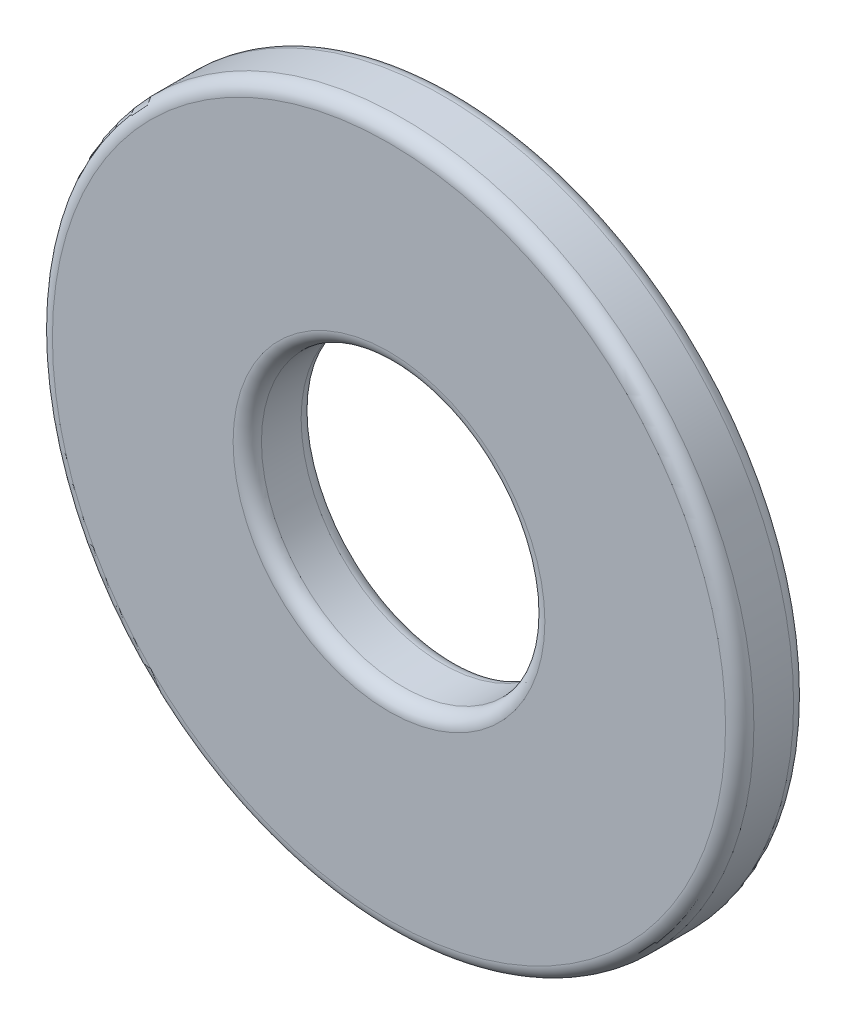
ISO-10303-21;
HEADER;
FILE_DESCRIPTION(('STEP AP214'),'2;1');
FILE_NAME('part.step','',(''),(''),'','','');
FILE_SCHEMA(('AUTOMOTIVE_DESIGN { 1 0 10303 214 1 1 1 1 }'));
ENDSEC;
DATA;
#1=APPLICATION_CONTEXT('core data for automotive mechanical design processes');
#2=APPLICATION_PROTOCOL_DEFINITION('international standard','automotive_design',2000,#1);
#3=PRODUCT_CONTEXT('',#1,'mechanical');
#4=PRODUCT('Part','Part','',(#3));
#5=PRODUCT_RELATED_PRODUCT_CATEGORY('part','',(#4));
#6=PRODUCT_DEFINITION_FORMATION('','',#4);
#7=PRODUCT_DEFINITION_CONTEXT('part definition',#1,'design');
#8=PRODUCT_DEFINITION('design','',#6,#7);
#9=PRODUCT_DEFINITION_SHAPE('','',#8);
#10=(LENGTH_UNIT() NAMED_UNIT(*) SI_UNIT(.MILLI.,.METRE.));
#11=(NAMED_UNIT(*) PLANE_ANGLE_UNIT() SI_UNIT($,.RADIAN.));
#12=(NAMED_UNIT(*) SI_UNIT($,.STERADIAN.) SOLID_ANGLE_UNIT());
#13=UNCERTAINTY_MEASURE_WITH_UNIT(LENGTH_MEASURE(1.E-05),#10,'distance_accuracy_value','');
#14=(GEOMETRIC_REPRESENTATION_CONTEXT(3) GLOBAL_UNCERTAINTY_ASSIGNED_CONTEXT((#13)) GLOBAL_UNIT_ASSIGNED_CONTEXT((#10,
#11,#12)) REPRESENTATION_CONTEXT('',''));
#15=CARTESIAN_POINT('',(0.,0.,0.));
#16=DIRECTION('',(0.,0.,1.));
#17=DIRECTION('',(1.,0.,0.));
#18=AXIS2_PLACEMENT_3D('',#15,#16,#17);
#19=CARTESIAN_POINT('',(0.,0.,0.96));
#20=DIRECTION('',(0.,0.,1.));
#21=DIRECTION('',(1.,0.,0.));
#22=AXIS2_PLACEMENT_3D('',#19,#20,#21);
#23=PLANE('',#22);
#24=CARTESIAN_POINT('',(0.,0.,0.96));
#25=DIRECTION('',(0.,0.,1.));
#26=DIRECTION('',(1.,0.,0.));
#27=AXIS2_PLACEMENT_3D('',#24,#25,#26);
#28=CIRCLE('',#27,2.2);
#29=CARTESIAN_POINT('',(2.2,0.,0.96));
#30=VERTEX_POINT('',#29);
#31=EDGE_CURVE('E10',#30,#30,#28,.F.);
#32=ORIENTED_EDGE('',*,*,#31,.T.);
#33=EDGE_LOOP('',(#32));
#34=FACE_BOUND('',#33,.T.);
#35=CARTESIAN_POINT('',(0.,0.,0.96));
#36=DIRECTION('',(0.,0.,1.));
#37=DIRECTION('',(1.,0.,0.));
#38=AXIS2_PLACEMENT_3D('',#35,#36,#37);
#39=CIRCLE('',#38,4.75);
#40=CARTESIAN_POINT('',(4.75,0.,0.96));
#41=VERTEX_POINT('',#40);
#42=EDGE_CURVE('E48',#41,#41,#39,.T.);
#43=ORIENTED_EDGE('',*,*,#42,.T.);
#44=EDGE_LOOP('',(#43));
#45=FACE_BOUND('',#44,.T.);
#46=ADVANCED_FACE('F41',(#34,#45),#23,.T.);
#47=CARTESIAN_POINT('',(0.,0.,0.));
#48=DIRECTION('',(0.,0.,1.));
#49=DIRECTION('',(1.,0.,0.));
#50=AXIS2_PLACEMENT_3D('',#47,#48,#49);
#51=PLANE('',#50);
#52=CARTESIAN_POINT('',(0.,0.,0.));
#53=DIRECTION('',(0.,0.,1.));
#54=DIRECTION('',(1.,0.,0.));
#55=AXIS2_PLACEMENT_3D('',#52,#53,#54);
#56=CIRCLE('',#55,2.2);
#57=CARTESIAN_POINT('',(2.2,0.,0.));
#58=VERTEX_POINT('',#57);
#59=EDGE_CURVE('E67',#58,#58,#56,.T.);
#60=ORIENTED_EDGE('',*,*,#59,.T.);
#61=EDGE_LOOP('',(#60));
#62=FACE_BOUND('',#61,.T.);
#63=CARTESIAN_POINT('',(0.,0.,0.));
#64=DIRECTION('',(0.,0.,1.));
#65=DIRECTION('',(1.,0.,0.));
#66=AXIS2_PLACEMENT_3D('',#63,#64,#65);
#67=CIRCLE('',#66,4.75);
#68=CARTESIAN_POINT('',(4.75,0.,0.));
#69=VERTEX_POINT('',#68);
#70=EDGE_CURVE('E70',#69,#69,#67,.F.);
#71=ORIENTED_EDGE('',*,*,#70,.T.);
#72=EDGE_LOOP('',(#71));
#73=FACE_BOUND('',#72,.T.);
#74=ADVANCED_FACE('F74',(#62,#73),#51,.F.);
#75=CARTESIAN_POINT('',(0.,0.,0.96));
#76=DIRECTION('',(0.,0.,-1.));
#77=DIRECTION('',(-1.,0.,0.));
#78=AXIS2_PLACEMENT_3D('',#75,#76,#77);
#79=CYLINDRICAL_SURFACE('',#78,4.95);
#80=CARTESIAN_POINT('',(0.,0.,0.2));
#81=DIRECTION('',(0.,0.,1.));
#82=DIRECTION('',(1.,0.,0.));
#83=AXIS2_PLACEMENT_3D('',#80,#81,#82);
#84=CIRCLE('',#83,4.95);
#85=CARTESIAN_POINT('',(4.95,0.,0.2));
#86=VERTEX_POINT('',#85);
#87=EDGE_CURVE('E52',#86,#86,#84,.T.);
#88=ORIENTED_EDGE('',*,*,#87,.T.);
#89=EDGE_LOOP('',(#88));
#90=FACE_BOUND('',#89,.T.);
#91=CARTESIAN_POINT('',(0.,0.,0.76));
#92=DIRECTION('',(0.,0.,1.));
#93=DIRECTION('',(1.,0.,0.));
#94=AXIS2_PLACEMENT_3D('',#91,#92,#93);
#95=CIRCLE('',#94,4.95);
#96=CARTESIAN_POINT('',(4.95,0.,0.76));
#97=VERTEX_POINT('',#96);
#98=EDGE_CURVE('E56',#97,#97,#95,.F.);
#99=ORIENTED_EDGE('',*,*,#98,.T.);
#100=EDGE_LOOP('',(#99));
#101=FACE_BOUND('',#100,.T.);
#102=ADVANCED_FACE('F84',(#90,#101),#79,.T.);
#103=CARTESIAN_POINT('',(0.,0.,0.96));
#104=DIRECTION('',(0.,0.,-1.));
#105=DIRECTION('',(-1.,0.,0.));
#106=AXIS2_PLACEMENT_3D('',#103,#104,#105);
#107=CYLINDRICAL_SURFACE('',#106,2.);
#108=CARTESIAN_POINT('',(0.,0.,0.2));
#109=DIRECTION('',(0.,0.,1.));
#110=DIRECTION('',(1.,0.,0.));
#111=AXIS2_PLACEMENT_3D('',#108,#109,#110);
#112=CIRCLE('',#111,2.);
#113=CARTESIAN_POINT('',(2.,0.,0.2));
#114=VERTEX_POINT('',#113);
#115=EDGE_CURVE('E61',#114,#114,#112,.F.);
#116=ORIENTED_EDGE('',*,*,#115,.T.);
#117=EDGE_LOOP('',(#116));
#118=FACE_BOUND('',#117,.T.);
#119=CARTESIAN_POINT('',(0.,0.,0.76));
#120=DIRECTION('',(0.,0.,1.));
#121=DIRECTION('',(1.,0.,0.));
#122=AXIS2_PLACEMENT_3D('',#119,#120,#121);
#123=CIRCLE('',#122,2.);
#124=CARTESIAN_POINT('',(2.,0.,0.76));
#125=VERTEX_POINT('',#124);
#126=EDGE_CURVE('E64',#125,#125,#123,.T.);
#127=ORIENTED_EDGE('',*,*,#126,.T.);
#128=EDGE_LOOP('',(#127));
#129=FACE_BOUND('',#128,.T.);
#130=ADVANCED_FACE('F87',(#118,#129),#107,.F.);
#131=CARTESIAN_POINT('',(0.,0.,0.2));
#132=DIRECTION('',(0.,0.,1.));
#133=DIRECTION('',(1.,0.,0.));
#134=AXIS2_PLACEMENT_3D('',#131,#132,#133);
#135=TOROIDAL_SURFACE('',#134,2.2,0.2);
#136=ORIENTED_EDGE('',*,*,#115,.F.);
#137=EDGE_LOOP('',(#136));
#138=FACE_BOUND('',#137,.T.);
#139=ORIENTED_EDGE('',*,*,#59,.F.);
#140=EDGE_LOOP('',(#139));
#141=FACE_BOUND('',#140,.T.);
#142=ADVANCED_FACE('F80',(#138,#141),#135,.T.);
#143=CARTESIAN_POINT('',(0.,0.,0.2));
#144=DIRECTION('',(0.,0.,1.));
#145=DIRECTION('',(1.,0.,0.));
#146=AXIS2_PLACEMENT_3D('',#143,#144,#145);
#147=TOROIDAL_SURFACE('',#146,4.75,0.2);
#148=ORIENTED_EDGE('',*,*,#70,.F.);
#149=EDGE_LOOP('',(#148));
#150=FACE_BOUND('',#149,.T.);
#151=ORIENTED_EDGE('',*,*,#87,.F.);
#152=EDGE_LOOP('',(#151));
#153=FACE_BOUND('',#152,.T.);
#154=ADVANCED_FACE('F76',(#150,#153),#147,.T.);
#155=CARTESIAN_POINT('',(0.,0.,0.76));
#156=DIRECTION('',(0.,0.,1.));
#157=DIRECTION('',(1.,0.,0.));
#158=AXIS2_PLACEMENT_3D('',#155,#156,#157);
#159=TOROIDAL_SURFACE('',#158,2.2,0.2);
#160=ORIENTED_EDGE('',*,*,#31,.F.);
#161=EDGE_LOOP('',(#160));
#162=FACE_BOUND('',#161,.T.);
#163=ORIENTED_EDGE('',*,*,#126,.F.);
#164=EDGE_LOOP('',(#163));
#165=FACE_BOUND('',#164,.T.);
#166=ADVANCED_FACE('F79',(#162,#165),#159,.T.);
#167=CARTESIAN_POINT('',(0.,0.,0.76));
#168=DIRECTION('',(0.,0.,1.));
#169=DIRECTION('',(1.,0.,0.));
#170=AXIS2_PLACEMENT_3D('',#167,#168,#169);
#171=TOROIDAL_SURFACE('',#170,4.75,0.2);
#172=ORIENTED_EDGE('',*,*,#98,.F.);
#173=EDGE_LOOP('',(#172));
#174=FACE_BOUND('',#173,.T.);
#175=ORIENTED_EDGE('',*,*,#42,.F.);
#176=EDGE_LOOP('',(#175));
#177=FACE_BOUND('',#176,.T.);
#178=ADVANCED_FACE('F43',(#174,#177),#171,.T.);
#179=CLOSED_SHELL('',(#46,#74,#102,#130,#142,#154,#166,#178));
#180=MANIFOLD_SOLID_BREP('B2',#179);
#181=ADVANCED_BREP_SHAPE_REPRESENTATION('',(#18,#180),#14);
#182=SHAPE_DEFINITION_REPRESENTATION(#9,#181);
ENDSEC;
END-ISO-10303-21;
